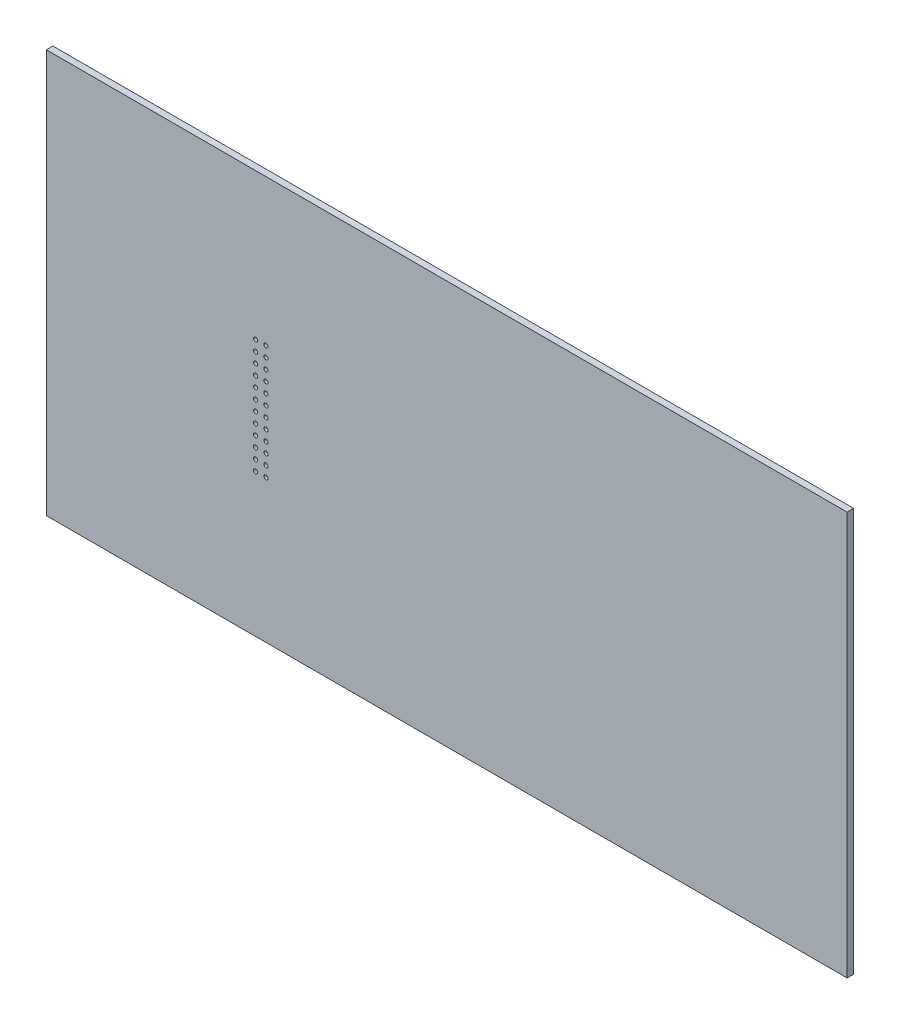
ISO-10303-21;
HEADER;
FILE_DESCRIPTION(('STEP AP214'),'2;1');
FILE_NAME('part.step','',(''),(''),'','','');
FILE_SCHEMA(('AUTOMOTIVE_DESIGN { 1 0 10303 214 1 1 1 1 }'));
ENDSEC;
DATA;
#1=APPLICATION_CONTEXT('core data for automotive mechanical design processes');
#2=APPLICATION_PROTOCOL_DEFINITION('international standard','automotive_design',2000,#1);
#3=PRODUCT_CONTEXT('',#1,'mechanical');
#4=PRODUCT('Part','Part','',(#3));
#5=PRODUCT_RELATED_PRODUCT_CATEGORY('part','',(#4));
#6=PRODUCT_DEFINITION_FORMATION('','',#4);
#7=PRODUCT_DEFINITION_CONTEXT('part definition',#1,'design');
#8=PRODUCT_DEFINITION('design','',#6,#7);
#9=PRODUCT_DEFINITION_SHAPE('','',#8);
#10=(LENGTH_UNIT() NAMED_UNIT(*) SI_UNIT(.MILLI.,.METRE.));
#11=(NAMED_UNIT(*) PLANE_ANGLE_UNIT() SI_UNIT($,.RADIAN.));
#12=(NAMED_UNIT(*) SI_UNIT($,.STERADIAN.) SOLID_ANGLE_UNIT());
#13=UNCERTAINTY_MEASURE_WITH_UNIT(LENGTH_MEASURE(1.E-05),#10,'distance_accuracy_value','');
#14=(GEOMETRIC_REPRESENTATION_CONTEXT(3) GLOBAL_UNCERTAINTY_ASSIGNED_CONTEXT((#13)) GLOBAL_UNIT_ASSIGNED_CONTEXT((#10,
#11,#12)) REPRESENTATION_CONTEXT('',''));
#15=CARTESIAN_POINT('',(0.,0.,0.));
#16=DIRECTION('',(0.,0.,1.));
#17=DIRECTION('',(1.,0.,0.));
#18=AXIS2_PLACEMENT_3D('',#15,#16,#17);
#19=CARTESIAN_POINT('',(0.,0.,1.6));
#20=DIRECTION('',(0.,0.,1.));
#21=DIRECTION('',(1.,0.,0.));
#22=AXIS2_PLACEMENT_3D('',#19,#20,#21);
#23=PLANE('',#22);
#24=CARTESIAN_POINT('',(119.5,-67.81,1.6));
#25=DIRECTION('',(0.,0.,-1.));
#26=DIRECTION('',(-1.,0.,0.));
#27=AXIS2_PLACEMENT_3D('',#24,#25,#26);
#28=CIRCLE('',#27,0.5);
#29=CARTESIAN_POINT('',(119.,-67.81,1.6));
#30=VERTEX_POINT('',#29);
#31=EDGE_CURVE('E151',#30,#30,#28,.T.);
#32=ORIENTED_EDGE('',*,*,#31,.T.);
#33=EDGE_LOOP('',(#32));
#34=FACE_BOUND('',#33,.T.);
#35=CARTESIAN_POINT('',(119.5,-70.35,1.6));
#36=DIRECTION('',(0.,0.,-1.));
#37=DIRECTION('',(-1.,0.,0.));
#38=AXIS2_PLACEMENT_3D('',#35,#36,#37);
#39=CIRCLE('',#38,0.5);
#40=CARTESIAN_POINT('',(119.,-70.35,1.6));
#41=VERTEX_POINT('',#40);
#42=EDGE_CURVE('E154',#41,#41,#39,.T.);
#43=ORIENTED_EDGE('',*,*,#42,.T.);
#44=EDGE_LOOP('',(#43));
#45=FACE_BOUND('',#44,.T.);
#46=CARTESIAN_POINT('',(119.5,-72.89,1.6));
#47=DIRECTION('',(0.,0.,-1.));
#48=DIRECTION('',(-1.,0.,0.));
#49=AXIS2_PLACEMENT_3D('',#46,#47,#48);
#50=CIRCLE('',#49,0.5);
#51=CARTESIAN_POINT('',(119.,-72.89,1.6));
#52=VERTEX_POINT('',#51);
#53=EDGE_CURVE('E157',#52,#52,#50,.T.);
#54=ORIENTED_EDGE('',*,*,#53,.T.);
#55=EDGE_LOOP('',(#54));
#56=FACE_BOUND('',#55,.T.);
#57=CARTESIAN_POINT('',(119.5,-75.43,1.6));
#58=DIRECTION('',(0.,0.,-1.));
#59=DIRECTION('',(-1.,0.,0.));
#60=AXIS2_PLACEMENT_3D('',#57,#58,#59);
#61=CIRCLE('',#60,0.5);
#62=CARTESIAN_POINT('',(119.,-75.43,1.6));
#63=VERTEX_POINT('',#62);
#64=EDGE_CURVE('E160',#63,#63,#61,.T.);
#65=ORIENTED_EDGE('',*,*,#64,.T.);
#66=EDGE_LOOP('',(#65));
#67=FACE_BOUND('',#66,.T.);
#68=CARTESIAN_POINT('',(119.5,-77.97,1.6));
#69=DIRECTION('',(0.,0.,-1.));
#70=DIRECTION('',(-1.,0.,0.));
#71=AXIS2_PLACEMENT_3D('',#68,#69,#70);
#72=CIRCLE('',#71,0.5);
#73=CARTESIAN_POINT('',(119.,-77.97,1.6));
#74=VERTEX_POINT('',#73);
#75=EDGE_CURVE('E163',#74,#74,#72,.T.);
#76=ORIENTED_EDGE('',*,*,#75,.T.);
#77=EDGE_LOOP('',(#76));
#78=FACE_BOUND('',#77,.T.);
#79=CARTESIAN_POINT('',(119.5,-80.51,1.6));
#80=DIRECTION('',(0.,0.,-1.));
#81=DIRECTION('',(-1.,0.,0.));
#82=AXIS2_PLACEMENT_3D('',#79,#80,#81);
#83=CIRCLE('',#82,0.5);
#84=CARTESIAN_POINT('',(119.,-80.51,1.6));
#85=VERTEX_POINT('',#84);
#86=EDGE_CURVE('E166',#85,#85,#83,.T.);
#87=ORIENTED_EDGE('',*,*,#86,.T.);
#88=EDGE_LOOP('',(#87));
#89=FACE_BOUND('',#88,.T.);
#90=CARTESIAN_POINT('',(116.96,-67.81,1.6));
#91=DIRECTION('',(0.,0.,-1.));
#92=DIRECTION('',(-1.,0.,0.));
#93=AXIS2_PLACEMENT_3D('',#90,#91,#92);
#94=CIRCLE('',#93,0.5);
#95=CARTESIAN_POINT('',(116.46,-67.81,1.6));
#96=VERTEX_POINT('',#95);
#97=EDGE_CURVE('E169',#96,#96,#94,.T.);
#98=ORIENTED_EDGE('',*,*,#97,.T.);
#99=EDGE_LOOP('',(#98));
#100=FACE_BOUND('',#99,.T.);
#101=CARTESIAN_POINT('',(116.96,-70.35,1.6));
#102=DIRECTION('',(0.,0.,-1.));
#103=DIRECTION('',(-1.,0.,0.));
#104=AXIS2_PLACEMENT_3D('',#101,#102,#103);
#105=CIRCLE('',#104,0.5);
#106=CARTESIAN_POINT('',(116.46,-70.35,1.6));
#107=VERTEX_POINT('',#106);
#108=EDGE_CURVE('E172',#107,#107,#105,.T.);
#109=ORIENTED_EDGE('',*,*,#108,.T.);
#110=EDGE_LOOP('',(#109));
#111=FACE_BOUND('',#110,.T.);
#112=CARTESIAN_POINT('',(116.96,-72.89,1.6));
#113=DIRECTION('',(0.,0.,-1.));
#114=DIRECTION('',(-1.,0.,0.));
#115=AXIS2_PLACEMENT_3D('',#112,#113,#114);
#116=CIRCLE('',#115,0.5);
#117=CARTESIAN_POINT('',(116.46,-72.89,1.6));
#118=VERTEX_POINT('',#117);
#119=EDGE_CURVE('E175',#118,#118,#116,.T.);
#120=ORIENTED_EDGE('',*,*,#119,.T.);
#121=EDGE_LOOP('',(#120));
#122=FACE_BOUND('',#121,.T.);
#123=CARTESIAN_POINT('',(116.96,-75.43,1.6));
#124=DIRECTION('',(0.,0.,-1.));
#125=DIRECTION('',(-1.,0.,0.));
#126=AXIS2_PLACEMENT_3D('',#123,#124,#125);
#127=CIRCLE('',#126,0.5);
#128=CARTESIAN_POINT('',(116.46,-75.43,1.6));
#129=VERTEX_POINT('',#128);
#130=EDGE_CURVE('E178',#129,#129,#127,.T.);
#131=ORIENTED_EDGE('',*,*,#130,.T.);
#132=EDGE_LOOP('',(#131));
#133=FACE_BOUND('',#132,.T.);
#134=CARTESIAN_POINT('',(116.96,-77.97,1.6));
#135=DIRECTION('',(0.,0.,-1.));
#136=DIRECTION('',(-1.,0.,0.));
#137=AXIS2_PLACEMENT_3D('',#134,#135,#136);
#138=CIRCLE('',#137,0.5);
#139=CARTESIAN_POINT('',(116.46,-77.97,1.6));
#140=VERTEX_POINT('',#139);
#141=EDGE_CURVE('E181',#140,#140,#138,.T.);
#142=ORIENTED_EDGE('',*,*,#141,.T.);
#143=EDGE_LOOP('',(#142));
#144=FACE_BOUND('',#143,.T.);
#145=CARTESIAN_POINT('',(116.96,-80.51,1.6));
#146=DIRECTION('',(0.,0.,-1.));
#147=DIRECTION('',(-1.,0.,0.));
#148=AXIS2_PLACEMENT_3D('',#145,#146,#147);
#149=CIRCLE('',#148,0.5);
#150=CARTESIAN_POINT('',(116.46,-80.51,1.6));
#151=VERTEX_POINT('',#150);
#152=EDGE_CURVE('E184',#151,#151,#149,.T.);
#153=ORIENTED_EDGE('',*,*,#152,.T.);
#154=EDGE_LOOP('',(#153));
#155=FACE_BOUND('',#154,.T.);
#156=CARTESIAN_POINT('',(119.5,-83.05,1.6));
#157=DIRECTION('',(0.,0.,-1.));
#158=DIRECTION('',(-1.,0.,0.));
#159=AXIS2_PLACEMENT_3D('',#156,#157,#158);
#160=CIRCLE('',#159,0.5);
#161=CARTESIAN_POINT('',(119.,-83.05,1.6));
#162=VERTEX_POINT('',#161);
#163=EDGE_CURVE('E187',#162,#162,#160,.T.);
#164=ORIENTED_EDGE('',*,*,#163,.T.);
#165=EDGE_LOOP('',(#164));
#166=FACE_BOUND('',#165,.T.);
#167=CARTESIAN_POINT('',(119.5,-85.59,1.6));
#168=DIRECTION('',(0.,0.,-1.));
#169=DIRECTION('',(-1.,0.,0.));
#170=AXIS2_PLACEMENT_3D('',#167,#168,#169);
#171=CIRCLE('',#170,0.5);
#172=CARTESIAN_POINT('',(119.,-85.59,1.6));
#173=VERTEX_POINT('',#172);
#174=EDGE_CURVE('E190',#173,#173,#171,.T.);
#175=ORIENTED_EDGE('',*,*,#174,.T.);
#176=EDGE_LOOP('',(#175));
#177=FACE_BOUND('',#176,.T.);
#178=CARTESIAN_POINT('',(119.5,-88.13,1.6));
#179=DIRECTION('',(0.,0.,-1.));
#180=DIRECTION('',(-1.,0.,0.));
#181=AXIS2_PLACEMENT_3D('',#178,#179,#180);
#182=CIRCLE('',#181,0.5);
#183=CARTESIAN_POINT('',(119.,-88.13,1.6));
#184=VERTEX_POINT('',#183);
#185=EDGE_CURVE('E193',#184,#184,#182,.T.);
#186=ORIENTED_EDGE('',*,*,#185,.T.);
#187=EDGE_LOOP('',(#186));
#188=FACE_BOUND('',#187,.T.);
#189=CARTESIAN_POINT('',(119.5,-90.67,1.6));
#190=DIRECTION('',(0.,0.,-1.));
#191=DIRECTION('',(-1.,0.,0.));
#192=AXIS2_PLACEMENT_3D('',#189,#190,#191);
#193=CIRCLE('',#192,0.5);
#194=CARTESIAN_POINT('',(119.,-90.67,1.6));
#195=VERTEX_POINT('',#194);
#196=EDGE_CURVE('E196',#195,#195,#193,.T.);
#197=ORIENTED_EDGE('',*,*,#196,.T.);
#198=EDGE_LOOP('',(#197));
#199=FACE_BOUND('',#198,.T.);
#200=CARTESIAN_POINT('',(119.5,-93.21,1.6));
#201=DIRECTION('',(0.,0.,-1.));
#202=DIRECTION('',(-1.,0.,0.));
#203=AXIS2_PLACEMENT_3D('',#200,#201,#202);
#204=CIRCLE('',#203,0.5);
#205=CARTESIAN_POINT('',(119.,-93.21,1.6));
#206=VERTEX_POINT('',#205);
#207=EDGE_CURVE('E199',#206,#206,#204,.T.);
#208=ORIENTED_EDGE('',*,*,#207,.T.);
#209=EDGE_LOOP('',(#208));
#210=FACE_BOUND('',#209,.T.);
#211=CARTESIAN_POINT('',(119.5,-95.75,1.6));
#212=DIRECTION('',(0.,0.,-1.));
#213=DIRECTION('',(-1.,0.,0.));
#214=AXIS2_PLACEMENT_3D('',#211,#212,#213);
#215=CIRCLE('',#214,0.5);
#216=CARTESIAN_POINT('',(119.,-95.75,1.6));
#217=VERTEX_POINT('',#216);
#218=EDGE_CURVE('E202',#217,#217,#215,.T.);
#219=ORIENTED_EDGE('',*,*,#218,.T.);
#220=EDGE_LOOP('',(#219));
#221=FACE_BOUND('',#220,.T.);
#222=CARTESIAN_POINT('',(116.96,-83.05,1.6));
#223=DIRECTION('',(0.,0.,-1.));
#224=DIRECTION('',(-1.,0.,0.));
#225=AXIS2_PLACEMENT_3D('',#222,#223,#224);
#226=CIRCLE('',#225,0.5);
#227=CARTESIAN_POINT('',(116.46,-83.05,1.6));
#228=VERTEX_POINT('',#227);
#229=EDGE_CURVE('E205',#228,#228,#226,.T.);
#230=ORIENTED_EDGE('',*,*,#229,.T.);
#231=EDGE_LOOP('',(#230));
#232=FACE_BOUND('',#231,.T.);
#233=CARTESIAN_POINT('',(116.96,-85.59,1.6));
#234=DIRECTION('',(0.,0.,-1.));
#235=DIRECTION('',(-1.,0.,0.));
#236=AXIS2_PLACEMENT_3D('',#233,#234,#235);
#237=CIRCLE('',#236,0.5);
#238=CARTESIAN_POINT('',(116.46,-85.59,1.6));
#239=VERTEX_POINT('',#238);
#240=EDGE_CURVE('E208',#239,#239,#237,.T.);
#241=ORIENTED_EDGE('',*,*,#240,.T.);
#242=EDGE_LOOP('',(#241));
#243=FACE_BOUND('',#242,.T.);
#244=CARTESIAN_POINT('',(116.96,-88.13,1.6));
#245=DIRECTION('',(0.,0.,-1.));
#246=DIRECTION('',(-1.,0.,0.));
#247=AXIS2_PLACEMENT_3D('',#244,#245,#246);
#248=CIRCLE('',#247,0.5);
#249=CARTESIAN_POINT('',(116.46,-88.13,1.6));
#250=VERTEX_POINT('',#249);
#251=EDGE_CURVE('E211',#250,#250,#248,.T.);
#252=ORIENTED_EDGE('',*,*,#251,.T.);
#253=EDGE_LOOP('',(#252));
#254=FACE_BOUND('',#253,.T.);
#255=CARTESIAN_POINT('',(116.96,-90.67,1.6));
#256=DIRECTION('',(0.,0.,-1.));
#257=DIRECTION('',(-1.,0.,0.));
#258=AXIS2_PLACEMENT_3D('',#255,#256,#257);
#259=CIRCLE('',#258,0.5);
#260=CARTESIAN_POINT('',(116.46,-90.67,1.6));
#261=VERTEX_POINT('',#260);
#262=EDGE_CURVE('E214',#261,#261,#259,.T.);
#263=ORIENTED_EDGE('',*,*,#262,.T.);
#264=EDGE_LOOP('',(#263));
#265=FACE_BOUND('',#264,.T.);
#266=CARTESIAN_POINT('',(116.96,-93.21,1.6));
#267=DIRECTION('',(0.,0.,-1.));
#268=DIRECTION('',(-1.,0.,0.));
#269=AXIS2_PLACEMENT_3D('',#266,#267,#268);
#270=CIRCLE('',#269,0.5);
#271=CARTESIAN_POINT('',(116.46,-93.21,1.6));
#272=VERTEX_POINT('',#271);
#273=EDGE_CURVE('E216',#272,#272,#270,.T.);
#274=ORIENTED_EDGE('',*,*,#273,.T.);
#275=EDGE_LOOP('',(#274));
#276=FACE_BOUND('',#275,.T.);
#277=CARTESIAN_POINT('',(116.96,-95.75,1.6));
#278=DIRECTION('',(0.,0.,-1.));
#279=DIRECTION('',(-1.,0.,0.));
#280=AXIS2_PLACEMENT_3D('',#277,#278,#279);
#281=CIRCLE('',#280,0.5);
#282=CARTESIAN_POINT('',(116.46,-95.75,1.6));
#283=VERTEX_POINT('',#282);
#284=EDGE_CURVE('E19',#283,#283,#281,.T.);
#285=ORIENTED_EDGE('',*,*,#284,.T.);
#286=EDGE_LOOP('',(#285));
#287=FACE_BOUND('',#286,.T.);
#288=DIRECTION('',(1.,0.,0.));
#289=VECTOR('',#288,1.);
#290=CARTESIAN_POINT('',(65.75,-32.,1.6));
#291=LINE('',#290,#289);
#292=CARTESIAN_POINT('',(65.75,-32.,1.6));
#293=VERTEX_POINT('',#292);
#294=CARTESIAN_POINT('',(261.75,-32.,1.6));
#295=VERTEX_POINT('',#294);
#296=EDGE_CURVE('E53',#293,#295,#291,.T.);
#297=ORIENTED_EDGE('',*,*,#296,.F.);
#298=DIRECTION('',(0.,1.,0.));
#299=VECTOR('',#298,1.);
#300=CARTESIAN_POINT('',(65.75,-130.75,1.6));
#301=LINE('',#300,#299);
#302=CARTESIAN_POINT('',(65.75,-130.75,1.6));
#303=VERTEX_POINT('',#302);
#304=EDGE_CURVE('E70',#303,#293,#301,.T.);
#305=ORIENTED_EDGE('',*,*,#304,.F.);
#306=DIRECTION('',(1.,0.,0.));
#307=VECTOR('',#306,1.);
#308=CARTESIAN_POINT('',(261.75,-130.75,1.6));
#309=LINE('',#308,#307);
#310=CARTESIAN_POINT('',(261.75,-130.75,1.6));
#311=VERTEX_POINT('',#310);
#312=EDGE_CURVE('E67',#311,#303,#309,.F.);
#313=ORIENTED_EDGE('',*,*,#312,.F.);
#314=DIRECTION('',(0.,1.,0.));
#315=VECTOR('',#314,1.);
#316=CARTESIAN_POINT('',(261.75,-32.,1.6));
#317=LINE('',#316,#315);
#318=EDGE_CURVE('E58',#295,#311,#317,.F.);
#319=ORIENTED_EDGE('',*,*,#318,.F.);
#320=EDGE_LOOP('',(#297,#305,#313,#319));
#321=FACE_BOUND('',#320,.T.);
#322=ADVANCED_FACE('F16',(#34,#45,#56,#67,#78,#89,#100,#111,#122,#133,#144,#155,#166,#177,#188,
#199,#210,#221,#232,#243,#254,#265,#276,#287,#321),#23,.T.);
#323=CARTESIAN_POINT('',(261.75,-130.75,0.));
#324=DIRECTION('',(0.,-1.,0.));
#325=DIRECTION('',(0.,0.,-1.));
#326=AXIS2_PLACEMENT_3D('',#323,#324,#325);
#327=PLANE('',#326);
#328=DIRECTION('',(0.,0.,1.));
#329=VECTOR('',#328,1.);
#330=CARTESIAN_POINT('',(65.75,-130.75,0.));
#331=LINE('',#330,#329);
#332=CARTESIAN_POINT('',(65.75,-130.75,0.));
#333=VERTEX_POINT('',#332);
#334=EDGE_CURVE('E224',#333,#303,#331,.T.);
#335=ORIENTED_EDGE('',*,*,#334,.F.);
#336=DIRECTION('',(1.,0.,0.));
#337=VECTOR('',#336,1.);
#338=CARTESIAN_POINT('',(0.,-130.75,0.));
#339=LINE('',#338,#337);
#340=CARTESIAN_POINT('',(261.75,-130.75,0.));
#341=VERTEX_POINT('',#340);
#342=EDGE_CURVE('E77',#333,#341,#339,.T.);
#343=ORIENTED_EDGE('',*,*,#342,.T.);
#344=DIRECTION('',(0.,0.,-1.));
#345=VECTOR('',#344,1.);
#346=CARTESIAN_POINT('',(261.75,-130.75,0.));
#347=LINE('',#346,#345);
#348=EDGE_CURVE('E63',#311,#341,#347,.T.);
#349=ORIENTED_EDGE('',*,*,#348,.F.);
#350=ORIENTED_EDGE('',*,*,#312,.T.);
#351=EDGE_LOOP('',(#335,#343,#349,#350));
#352=FACE_BOUND('',#351,.T.);
#353=ADVANCED_FACE('F76',(#352),#327,.T.);
#354=CARTESIAN_POINT('',(261.75,-32.,0.));
#355=DIRECTION('',(1.,0.,0.));
#356=DIRECTION('',(0.,0.,-1.));
#357=AXIS2_PLACEMENT_3D('',#354,#355,#356);
#358=PLANE('',#357);
#359=ORIENTED_EDGE('',*,*,#348,.T.);
#360=DIRECTION('',(0.,1.,0.));
#361=VECTOR('',#360,1.);
#362=CARTESIAN_POINT('',(261.75,0.,0.));
#363=LINE('',#362,#361);
#364=CARTESIAN_POINT('',(261.75,-32.,0.));
#365=VERTEX_POINT('',#364);
#366=EDGE_CURVE('E235',#341,#365,#363,.T.);
#367=ORIENTED_EDGE('',*,*,#366,.T.);
#368=DIRECTION('',(0.,0.,1.));
#369=VECTOR('',#368,1.);
#370=CARTESIAN_POINT('',(261.75,-32.,0.));
#371=LINE('',#370,#369);
#372=EDGE_CURVE('E65',#295,#365,#371,.F.);
#373=ORIENTED_EDGE('',*,*,#372,.F.);
#374=ORIENTED_EDGE('',*,*,#318,.T.);
#375=EDGE_LOOP('',(#359,#367,#373,#374));
#376=FACE_BOUND('',#375,.T.);
#377=ADVANCED_FACE('F60',(#376),#358,.T.);
#378=CARTESIAN_POINT('',(65.75,-32.,0.));
#379=DIRECTION('',(0.,1.,0.));
#380=DIRECTION('',(0.,0.,1.));
#381=AXIS2_PLACEMENT_3D('',#378,#379,#380);
#382=PLANE('',#381);
#383=ORIENTED_EDGE('',*,*,#372,.T.);
#384=DIRECTION('',(1.,0.,0.));
#385=VECTOR('',#384,1.);
#386=CARTESIAN_POINT('',(0.,-32.,0.));
#387=LINE('',#386,#385);
#388=CARTESIAN_POINT('',(65.75,-32.,0.));
#389=VERTEX_POINT('',#388);
#390=EDGE_CURVE('E232',#365,#389,#387,.F.);
#391=ORIENTED_EDGE('',*,*,#390,.T.);
#392=DIRECTION('',(0.,0.,1.));
#393=VECTOR('',#392,1.);
#394=CARTESIAN_POINT('',(65.75,-32.,0.));
#395=LINE('',#394,#393);
#396=EDGE_CURVE('E34',#293,#389,#395,.F.);
#397=ORIENTED_EDGE('',*,*,#396,.F.);
#398=ORIENTED_EDGE('',*,*,#296,.T.);
#399=EDGE_LOOP('',(#383,#391,#397,#398));
#400=FACE_BOUND('',#399,.T.);
#401=ADVANCED_FACE('F231',(#400),#382,.T.);
#402=CARTESIAN_POINT('',(65.75,-130.75,0.));
#403=DIRECTION('',(-1.,0.,0.));
#404=DIRECTION('',(0.,0.,1.));
#405=AXIS2_PLACEMENT_3D('',#402,#403,#404);
#406=PLANE('',#405);
#407=ORIENTED_EDGE('',*,*,#396,.T.);
#408=DIRECTION('',(0.,1.,0.));
#409=VECTOR('',#408,1.);
#410=CARTESIAN_POINT('',(65.75,0.,0.));
#411=LINE('',#410,#409);
#412=EDGE_CURVE('E150',#389,#333,#411,.F.);
#413=ORIENTED_EDGE('',*,*,#412,.T.);
#414=ORIENTED_EDGE('',*,*,#334,.T.);
#415=ORIENTED_EDGE('',*,*,#304,.T.);
#416=EDGE_LOOP('',(#407,#413,#414,#415));
#417=FACE_BOUND('',#416,.T.);
#418=ADVANCED_FACE('F238',(#417),#406,.T.);
#419=CARTESIAN_POINT('',(116.96,-95.75,-0.045));
#420=DIRECTION('',(0.,0.,-1.));
#421=DIRECTION('',(-1.,0.,0.));
#422=AXIS2_PLACEMENT_3D('',#419,#420,#421);
#423=CYLINDRICAL_SURFACE('',#422,0.5);
#424=ORIENTED_EDGE('',*,*,#284,.F.);
#425=EDGE_LOOP('',(#424));
#426=FACE_BOUND('',#425,.T.);
#427=CARTESIAN_POINT('',(116.96,-95.75,0.));
#428=DIRECTION('',(0.,0.,-1.));
#429=DIRECTION('',(-1.,0.,0.));
#430=AXIS2_PLACEMENT_3D('',#427,#428,#429);
#431=CIRCLE('',#430,0.5);
#432=CARTESIAN_POINT('',(116.46,-95.75,0.));
#433=VERTEX_POINT('',#432);
#434=EDGE_CURVE('E147',#433,#433,#431,.T.);
#435=ORIENTED_EDGE('',*,*,#434,.T.);
#436=EDGE_LOOP('',(#435));
#437=FACE_BOUND('',#436,.T.);
#438=ADVANCED_FACE('F240',(#426,#437),#423,.F.);
#439=CARTESIAN_POINT('',(116.96,-93.21,-0.045));
#440=DIRECTION('',(0.,0.,-1.));
#441=DIRECTION('',(-1.,0.,0.));
#442=AXIS2_PLACEMENT_3D('',#439,#440,#441);
#443=CYLINDRICAL_SURFACE('',#442,0.5);
#444=ORIENTED_EDGE('',*,*,#273,.F.);
#445=EDGE_LOOP('',(#444));
#446=FACE_BOUND('',#445,.T.);
#447=CARTESIAN_POINT('',(116.96,-93.21,0.));
#448=DIRECTION('',(0.,0.,-1.));
#449=DIRECTION('',(-1.,0.,0.));
#450=AXIS2_PLACEMENT_3D('',#447,#448,#449);
#451=CIRCLE('',#450,0.5);
#452=CARTESIAN_POINT('',(116.46,-93.21,0.));
#453=VERTEX_POINT('',#452);
#454=EDGE_CURVE('E144',#453,#453,#451,.T.);
#455=ORIENTED_EDGE('',*,*,#454,.T.);
#456=EDGE_LOOP('',(#455));
#457=FACE_BOUND('',#456,.T.);
#458=ADVANCED_FACE('F247',(#446,#457),#443,.F.);
#459=CARTESIAN_POINT('',(116.96,-90.67,-0.045));
#460=DIRECTION('',(0.,0.,-1.));
#461=DIRECTION('',(-1.,0.,0.));
#462=AXIS2_PLACEMENT_3D('',#459,#460,#461);
#463=CYLINDRICAL_SURFACE('',#462,0.5);
#464=ORIENTED_EDGE('',*,*,#262,.F.);
#465=EDGE_LOOP('',(#464));
#466=FACE_BOUND('',#465,.T.);
#467=CARTESIAN_POINT('',(116.96,-90.67,0.));
#468=DIRECTION('',(0.,0.,-1.));
#469=DIRECTION('',(-1.,0.,0.));
#470=AXIS2_PLACEMENT_3D('',#467,#468,#469);
#471=CIRCLE('',#470,0.5);
#472=CARTESIAN_POINT('',(116.46,-90.67,0.));
#473=VERTEX_POINT('',#472);
#474=EDGE_CURVE('E141',#473,#473,#471,.T.);
#475=ORIENTED_EDGE('',*,*,#474,.T.);
#476=EDGE_LOOP('',(#475));
#477=FACE_BOUND('',#476,.T.);
#478=ADVANCED_FACE('F342',(#466,#477),#463,.F.);
#479=CARTESIAN_POINT('',(116.96,-88.13,-0.045));
#480=DIRECTION('',(0.,0.,-1.));
#481=DIRECTION('',(-1.,0.,0.));
#482=AXIS2_PLACEMENT_3D('',#479,#480,#481);
#483=CYLINDRICAL_SURFACE('',#482,0.5);
#484=ORIENTED_EDGE('',*,*,#251,.F.);
#485=EDGE_LOOP('',(#484));
#486=FACE_BOUND('',#485,.T.);
#487=CARTESIAN_POINT('',(116.96,-88.13,0.));
#488=DIRECTION('',(0.,0.,-1.));
#489=DIRECTION('',(-1.,0.,0.));
#490=AXIS2_PLACEMENT_3D('',#487,#488,#489);
#491=CIRCLE('',#490,0.5);
#492=CARTESIAN_POINT('',(116.46,-88.13,0.));
#493=VERTEX_POINT('',#492);
#494=EDGE_CURVE('E138',#493,#493,#491,.T.);
#495=ORIENTED_EDGE('',*,*,#494,.T.);
#496=EDGE_LOOP('',(#495));
#497=FACE_BOUND('',#496,.T.);
#498=ADVANCED_FACE('F338',(#486,#497),#483,.F.);
#499=CARTESIAN_POINT('',(116.96,-85.59,-0.045));
#500=DIRECTION('',(0.,0.,-1.));
#501=DIRECTION('',(-1.,0.,0.));
#502=AXIS2_PLACEMENT_3D('',#499,#500,#501);
#503=CYLINDRICAL_SURFACE('',#502,0.5);
#504=ORIENTED_EDGE('',*,*,#240,.F.);
#505=EDGE_LOOP('',(#504));
#506=FACE_BOUND('',#505,.T.);
#507=CARTESIAN_POINT('',(116.96,-85.59,0.));
#508=DIRECTION('',(0.,0.,-1.));
#509=DIRECTION('',(-1.,0.,0.));
#510=AXIS2_PLACEMENT_3D('',#507,#508,#509);
#511=CIRCLE('',#510,0.5);
#512=CARTESIAN_POINT('',(116.46,-85.59,0.));
#513=VERTEX_POINT('',#512);
#514=EDGE_CURVE('E135',#513,#513,#511,.T.);
#515=ORIENTED_EDGE('',*,*,#514,.T.);
#516=EDGE_LOOP('',(#515));
#517=FACE_BOUND('',#516,.T.);
#518=ADVANCED_FACE('F334',(#506,#517),#503,.F.);
#519=CARTESIAN_POINT('',(116.96,-83.05,-0.045));
#520=DIRECTION('',(0.,0.,-1.));
#521=DIRECTION('',(-1.,0.,0.));
#522=AXIS2_PLACEMENT_3D('',#519,#520,#521);
#523=CYLINDRICAL_SURFACE('',#522,0.5);
#524=ORIENTED_EDGE('',*,*,#229,.F.);
#525=EDGE_LOOP('',(#524));
#526=FACE_BOUND('',#525,.T.);
#527=CARTESIAN_POINT('',(116.96,-83.05,0.));
#528=DIRECTION('',(0.,0.,-1.));
#529=DIRECTION('',(-1.,0.,0.));
#530=AXIS2_PLACEMENT_3D('',#527,#528,#529);
#531=CIRCLE('',#530,0.5);
#532=CARTESIAN_POINT('',(116.46,-83.05,0.));
#533=VERTEX_POINT('',#532);
#534=EDGE_CURVE('E132',#533,#533,#531,.T.);
#535=ORIENTED_EDGE('',*,*,#534,.T.);
#536=EDGE_LOOP('',(#535));
#537=FACE_BOUND('',#536,.T.);
#538=ADVANCED_FACE('F330',(#526,#537),#523,.F.);
#539=CARTESIAN_POINT('',(119.5,-95.75,-0.045));
#540=DIRECTION('',(0.,0.,-1.));
#541=DIRECTION('',(-1.,0.,0.));
#542=AXIS2_PLACEMENT_3D('',#539,#540,#541);
#543=CYLINDRICAL_SURFACE('',#542,0.5);
#544=ORIENTED_EDGE('',*,*,#218,.F.);
#545=EDGE_LOOP('',(#544));
#546=FACE_BOUND('',#545,.T.);
#547=CARTESIAN_POINT('',(119.5,-95.75,0.));
#548=DIRECTION('',(0.,0.,-1.));
#549=DIRECTION('',(-1.,0.,0.));
#550=AXIS2_PLACEMENT_3D('',#547,#548,#549);
#551=CIRCLE('',#550,0.5);
#552=CARTESIAN_POINT('',(119.,-95.75,0.));
#553=VERTEX_POINT('',#552);
#554=EDGE_CURVE('E129',#553,#553,#551,.T.);
#555=ORIENTED_EDGE('',*,*,#554,.T.);
#556=EDGE_LOOP('',(#555));
#557=FACE_BOUND('',#556,.T.);
#558=ADVANCED_FACE('F326',(#546,#557),#543,.F.);
#559=CARTESIAN_POINT('',(119.5,-93.21,-0.045));
#560=DIRECTION('',(0.,0.,-1.));
#561=DIRECTION('',(-1.,0.,0.));
#562=AXIS2_PLACEMENT_3D('',#559,#560,#561);
#563=CYLINDRICAL_SURFACE('',#562,0.5);
#564=ORIENTED_EDGE('',*,*,#207,.F.);
#565=EDGE_LOOP('',(#564));
#566=FACE_BOUND('',#565,.T.);
#567=CARTESIAN_POINT('',(119.5,-93.21,0.));
#568=DIRECTION('',(0.,0.,-1.));
#569=DIRECTION('',(-1.,0.,0.));
#570=AXIS2_PLACEMENT_3D('',#567,#568,#569);
#571=CIRCLE('',#570,0.5);
#572=CARTESIAN_POINT('',(119.,-93.21,0.));
#573=VERTEX_POINT('',#572);
#574=EDGE_CURVE('E126',#573,#573,#571,.T.);
#575=ORIENTED_EDGE('',*,*,#574,.T.);
#576=EDGE_LOOP('',(#575));
#577=FACE_BOUND('',#576,.T.);
#578=ADVANCED_FACE('F322',(#566,#577),#563,.F.);
#579=CARTESIAN_POINT('',(119.5,-90.67,-0.045));
#580=DIRECTION('',(0.,0.,-1.));
#581=DIRECTION('',(-1.,0.,0.));
#582=AXIS2_PLACEMENT_3D('',#579,#580,#581);
#583=CYLINDRICAL_SURFACE('',#582,0.5);
#584=ORIENTED_EDGE('',*,*,#196,.F.);
#585=EDGE_LOOP('',(#584));
#586=FACE_BOUND('',#585,.T.);
#587=CARTESIAN_POINT('',(119.5,-90.67,0.));
#588=DIRECTION('',(0.,0.,-1.));
#589=DIRECTION('',(-1.,0.,0.));
#590=AXIS2_PLACEMENT_3D('',#587,#588,#589);
#591=CIRCLE('',#590,0.5);
#592=CARTESIAN_POINT('',(119.,-90.67,0.));
#593=VERTEX_POINT('',#592);
#594=EDGE_CURVE('E123',#593,#593,#591,.T.);
#595=ORIENTED_EDGE('',*,*,#594,.T.);
#596=EDGE_LOOP('',(#595));
#597=FACE_BOUND('',#596,.T.);
#598=ADVANCED_FACE('F318',(#586,#597),#583,.F.);
#599=CARTESIAN_POINT('',(119.5,-88.13,-0.045));
#600=DIRECTION('',(0.,0.,-1.));
#601=DIRECTION('',(-1.,0.,0.));
#602=AXIS2_PLACEMENT_3D('',#599,#600,#601);
#603=CYLINDRICAL_SURFACE('',#602,0.5);
#604=ORIENTED_EDGE('',*,*,#185,.F.);
#605=EDGE_LOOP('',(#604));
#606=FACE_BOUND('',#605,.T.);
#607=CARTESIAN_POINT('',(119.5,-88.13,0.));
#608=DIRECTION('',(0.,0.,-1.));
#609=DIRECTION('',(-1.,0.,0.));
#610=AXIS2_PLACEMENT_3D('',#607,#608,#609);
#611=CIRCLE('',#610,0.5);
#612=CARTESIAN_POINT('',(119.,-88.13,0.));
#613=VERTEX_POINT('',#612);
#614=EDGE_CURVE('E120',#613,#613,#611,.T.);
#615=ORIENTED_EDGE('',*,*,#614,.T.);
#616=EDGE_LOOP('',(#615));
#617=FACE_BOUND('',#616,.T.);
#618=ADVANCED_FACE('F314',(#606,#617),#603,.F.);
#619=CARTESIAN_POINT('',(119.5,-85.59,-0.045));
#620=DIRECTION('',(0.,0.,-1.));
#621=DIRECTION('',(-1.,0.,0.));
#622=AXIS2_PLACEMENT_3D('',#619,#620,#621);
#623=CYLINDRICAL_SURFACE('',#622,0.5);
#624=ORIENTED_EDGE('',*,*,#174,.F.);
#625=EDGE_LOOP('',(#624));
#626=FACE_BOUND('',#625,.T.);
#627=CARTESIAN_POINT('',(119.5,-85.59,0.));
#628=DIRECTION('',(0.,0.,-1.));
#629=DIRECTION('',(-1.,0.,0.));
#630=AXIS2_PLACEMENT_3D('',#627,#628,#629);
#631=CIRCLE('',#630,0.5);
#632=CARTESIAN_POINT('',(119.,-85.59,0.));
#633=VERTEX_POINT('',#632);
#634=EDGE_CURVE('E117',#633,#633,#631,.T.);
#635=ORIENTED_EDGE('',*,*,#634,.T.);
#636=EDGE_LOOP('',(#635));
#637=FACE_BOUND('',#636,.T.);
#638=ADVANCED_FACE('F310',(#626,#637),#623,.F.);
#639=CARTESIAN_POINT('',(119.5,-83.05,-0.045));
#640=DIRECTION('',(0.,0.,-1.));
#641=DIRECTION('',(-1.,0.,0.));
#642=AXIS2_PLACEMENT_3D('',#639,#640,#641);
#643=CYLINDRICAL_SURFACE('',#642,0.5);
#644=ORIENTED_EDGE('',*,*,#163,.F.);
#645=EDGE_LOOP('',(#644));
#646=FACE_BOUND('',#645,.T.);
#647=CARTESIAN_POINT('',(119.5,-83.05,0.));
#648=DIRECTION('',(0.,0.,-1.));
#649=DIRECTION('',(-1.,0.,0.));
#650=AXIS2_PLACEMENT_3D('',#647,#648,#649);
#651=CIRCLE('',#650,0.5);
#652=CARTESIAN_POINT('',(119.,-83.05,0.));
#653=VERTEX_POINT('',#652);
#654=EDGE_CURVE('E114',#653,#653,#651,.T.);
#655=ORIENTED_EDGE('',*,*,#654,.T.);
#656=EDGE_LOOP('',(#655));
#657=FACE_BOUND('',#656,.T.);
#658=ADVANCED_FACE('F306',(#646,#657),#643,.F.);
#659=CARTESIAN_POINT('',(116.96,-80.51,-0.045));
#660=DIRECTION('',(0.,0.,-1.));
#661=DIRECTION('',(-1.,0.,0.));
#662=AXIS2_PLACEMENT_3D('',#659,#660,#661);
#663=CYLINDRICAL_SURFACE('',#662,0.5);
#664=ORIENTED_EDGE('',*,*,#152,.F.);
#665=EDGE_LOOP('',(#664));
#666=FACE_BOUND('',#665,.T.);
#667=CARTESIAN_POINT('',(116.96,-80.51,0.));
#668=DIRECTION('',(0.,0.,-1.));
#669=DIRECTION('',(-1.,0.,0.));
#670=AXIS2_PLACEMENT_3D('',#667,#668,#669);
#671=CIRCLE('',#670,0.5);
#672=CARTESIAN_POINT('',(116.46,-80.51,0.));
#673=VERTEX_POINT('',#672);
#674=EDGE_CURVE('E111',#673,#673,#671,.T.);
#675=ORIENTED_EDGE('',*,*,#674,.T.);
#676=EDGE_LOOP('',(#675));
#677=FACE_BOUND('',#676,.T.);
#678=ADVANCED_FACE('F302',(#666,#677),#663,.F.);
#679=CARTESIAN_POINT('',(116.96,-77.97,-0.045));
#680=DIRECTION('',(0.,0.,-1.));
#681=DIRECTION('',(-1.,0.,0.));
#682=AXIS2_PLACEMENT_3D('',#679,#680,#681);
#683=CYLINDRICAL_SURFACE('',#682,0.5);
#684=ORIENTED_EDGE('',*,*,#141,.F.);
#685=EDGE_LOOP('',(#684));
#686=FACE_BOUND('',#685,.T.);
#687=CARTESIAN_POINT('',(116.96,-77.97,0.));
#688=DIRECTION('',(0.,0.,-1.));
#689=DIRECTION('',(-1.,0.,0.));
#690=AXIS2_PLACEMENT_3D('',#687,#688,#689);
#691=CIRCLE('',#690,0.5);
#692=CARTESIAN_POINT('',(116.46,-77.97,0.));
#693=VERTEX_POINT('',#692);
#694=EDGE_CURVE('E108',#693,#693,#691,.T.);
#695=ORIENTED_EDGE('',*,*,#694,.T.);
#696=EDGE_LOOP('',(#695));
#697=FACE_BOUND('',#696,.T.);
#698=ADVANCED_FACE('F298',(#686,#697),#683,.F.);
#699=CARTESIAN_POINT('',(116.96,-75.43,-0.045));
#700=DIRECTION('',(0.,0.,-1.));
#701=DIRECTION('',(-1.,0.,0.));
#702=AXIS2_PLACEMENT_3D('',#699,#700,#701);
#703=CYLINDRICAL_SURFACE('',#702,0.5);
#704=ORIENTED_EDGE('',*,*,#130,.F.);
#705=EDGE_LOOP('',(#704));
#706=FACE_BOUND('',#705,.T.);
#707=CARTESIAN_POINT('',(116.96,-75.43,0.));
#708=DIRECTION('',(0.,0.,-1.));
#709=DIRECTION('',(-1.,0.,0.));
#710=AXIS2_PLACEMENT_3D('',#707,#708,#709);
#711=CIRCLE('',#710,0.5);
#712=CARTESIAN_POINT('',(116.46,-75.43,0.));
#713=VERTEX_POINT('',#712);
#714=EDGE_CURVE('E105',#713,#713,#711,.T.);
#715=ORIENTED_EDGE('',*,*,#714,.T.);
#716=EDGE_LOOP('',(#715));
#717=FACE_BOUND('',#716,.T.);
#718=ADVANCED_FACE('F294',(#706,#717),#703,.F.);
#719=CARTESIAN_POINT('',(116.96,-72.89,-0.045));
#720=DIRECTION('',(0.,0.,-1.));
#721=DIRECTION('',(-1.,0.,0.));
#722=AXIS2_PLACEMENT_3D('',#719,#720,#721);
#723=CYLINDRICAL_SURFACE('',#722,0.5);
#724=ORIENTED_EDGE('',*,*,#119,.F.);
#725=EDGE_LOOP('',(#724));
#726=FACE_BOUND('',#725,.T.);
#727=CARTESIAN_POINT('',(116.96,-72.89,0.));
#728=DIRECTION('',(0.,0.,-1.));
#729=DIRECTION('',(-1.,0.,0.));
#730=AXIS2_PLACEMENT_3D('',#727,#728,#729);
#731=CIRCLE('',#730,0.5);
#732=CARTESIAN_POINT('',(116.46,-72.89,0.));
#733=VERTEX_POINT('',#732);
#734=EDGE_CURVE('E102',#733,#733,#731,.T.);
#735=ORIENTED_EDGE('',*,*,#734,.T.);
#736=EDGE_LOOP('',(#735));
#737=FACE_BOUND('',#736,.T.);
#738=ADVANCED_FACE('F290',(#726,#737),#723,.F.);
#739=CARTESIAN_POINT('',(116.96,-70.35,-0.045));
#740=DIRECTION('',(0.,0.,-1.));
#741=DIRECTION('',(-1.,0.,0.));
#742=AXIS2_PLACEMENT_3D('',#739,#740,#741);
#743=CYLINDRICAL_SURFACE('',#742,0.5);
#744=ORIENTED_EDGE('',*,*,#108,.F.);
#745=EDGE_LOOP('',(#744));
#746=FACE_BOUND('',#745,.T.);
#747=CARTESIAN_POINT('',(116.96,-70.35,0.));
#748=DIRECTION('',(0.,0.,-1.));
#749=DIRECTION('',(-1.,0.,0.));
#750=AXIS2_PLACEMENT_3D('',#747,#748,#749);
#751=CIRCLE('',#750,0.5);
#752=CARTESIAN_POINT('',(116.46,-70.35,0.));
#753=VERTEX_POINT('',#752);
#754=EDGE_CURVE('E99',#753,#753,#751,.T.);
#755=ORIENTED_EDGE('',*,*,#754,.T.);
#756=EDGE_LOOP('',(#755));
#757=FACE_BOUND('',#756,.T.);
#758=ADVANCED_FACE('F286',(#746,#757),#743,.F.);
#759=CARTESIAN_POINT('',(116.96,-67.81,-0.045));
#760=DIRECTION('',(0.,0.,-1.));
#761=DIRECTION('',(-1.,0.,0.));
#762=AXIS2_PLACEMENT_3D('',#759,#760,#761);
#763=CYLINDRICAL_SURFACE('',#762,0.5);
#764=ORIENTED_EDGE('',*,*,#97,.F.);
#765=EDGE_LOOP('',(#764));
#766=FACE_BOUND('',#765,.T.);
#767=CARTESIAN_POINT('',(116.96,-67.81,0.));
#768=DIRECTION('',(0.,0.,-1.));
#769=DIRECTION('',(-1.,0.,0.));
#770=AXIS2_PLACEMENT_3D('',#767,#768,#769);
#771=CIRCLE('',#770,0.5);
#772=CARTESIAN_POINT('',(116.46,-67.81,0.));
#773=VERTEX_POINT('',#772);
#774=EDGE_CURVE('E96',#773,#773,#771,.T.);
#775=ORIENTED_EDGE('',*,*,#774,.T.);
#776=EDGE_LOOP('',(#775));
#777=FACE_BOUND('',#776,.T.);
#778=ADVANCED_FACE('F282',(#766,#777),#763,.F.);
#779=CARTESIAN_POINT('',(119.5,-80.51,-0.045));
#780=DIRECTION('',(0.,0.,-1.));
#781=DIRECTION('',(-1.,0.,0.));
#782=AXIS2_PLACEMENT_3D('',#779,#780,#781);
#783=CYLINDRICAL_SURFACE('',#782,0.5);
#784=ORIENTED_EDGE('',*,*,#86,.F.);
#785=EDGE_LOOP('',(#784));
#786=FACE_BOUND('',#785,.T.);
#787=CARTESIAN_POINT('',(119.5,-80.51,0.));
#788=DIRECTION('',(0.,0.,-1.));
#789=DIRECTION('',(-1.,0.,0.));
#790=AXIS2_PLACEMENT_3D('',#787,#788,#789);
#791=CIRCLE('',#790,0.5);
#792=CARTESIAN_POINT('',(119.,-80.51,0.));
#793=VERTEX_POINT('',#792);
#794=EDGE_CURVE('E93',#793,#793,#791,.T.);
#795=ORIENTED_EDGE('',*,*,#794,.T.);
#796=EDGE_LOOP('',(#795));
#797=FACE_BOUND('',#796,.T.);
#798=ADVANCED_FACE('F278',(#786,#797),#783,.F.);
#799=CARTESIAN_POINT('',(119.5,-77.97,-0.045));
#800=DIRECTION('',(0.,0.,-1.));
#801=DIRECTION('',(-1.,0.,0.));
#802=AXIS2_PLACEMENT_3D('',#799,#800,#801);
#803=CYLINDRICAL_SURFACE('',#802,0.5);
#804=ORIENTED_EDGE('',*,*,#75,.F.);
#805=EDGE_LOOP('',(#804));
#806=FACE_BOUND('',#805,.T.);
#807=CARTESIAN_POINT('',(119.5,-77.97,0.));
#808=DIRECTION('',(0.,0.,-1.));
#809=DIRECTION('',(-1.,0.,0.));
#810=AXIS2_PLACEMENT_3D('',#807,#808,#809);
#811=CIRCLE('',#810,0.5);
#812=CARTESIAN_POINT('',(119.,-77.97,0.));
#813=VERTEX_POINT('',#812);
#814=EDGE_CURVE('E90',#813,#813,#811,.T.);
#815=ORIENTED_EDGE('',*,*,#814,.T.);
#816=EDGE_LOOP('',(#815));
#817=FACE_BOUND('',#816,.T.);
#818=ADVANCED_FACE('F274',(#806,#817),#803,.F.);
#819=CARTESIAN_POINT('',(119.5,-75.43,-0.045));
#820=DIRECTION('',(0.,0.,-1.));
#821=DIRECTION('',(-1.,0.,0.));
#822=AXIS2_PLACEMENT_3D('',#819,#820,#821);
#823=CYLINDRICAL_SURFACE('',#822,0.5);
#824=ORIENTED_EDGE('',*,*,#64,.F.);
#825=EDGE_LOOP('',(#824));
#826=FACE_BOUND('',#825,.T.);
#827=CARTESIAN_POINT('',(119.5,-75.43,0.));
#828=DIRECTION('',(0.,0.,-1.));
#829=DIRECTION('',(-1.,0.,0.));
#830=AXIS2_PLACEMENT_3D('',#827,#828,#829);
#831=CIRCLE('',#830,0.5);
#832=CARTESIAN_POINT('',(119.,-75.43,0.));
#833=VERTEX_POINT('',#832);
#834=EDGE_CURVE('E87',#833,#833,#831,.T.);
#835=ORIENTED_EDGE('',*,*,#834,.T.);
#836=EDGE_LOOP('',(#835));
#837=FACE_BOUND('',#836,.T.);
#838=ADVANCED_FACE('F270',(#826,#837),#823,.F.);
#839=CARTESIAN_POINT('',(119.5,-72.89,-0.045));
#840=DIRECTION('',(0.,0.,-1.));
#841=DIRECTION('',(-1.,0.,0.));
#842=AXIS2_PLACEMENT_3D('',#839,#840,#841);
#843=CYLINDRICAL_SURFACE('',#842,0.5);
#844=ORIENTED_EDGE('',*,*,#53,.F.);
#845=EDGE_LOOP('',(#844));
#846=FACE_BOUND('',#845,.T.);
#847=CARTESIAN_POINT('',(119.5,-72.89,0.));
#848=DIRECTION('',(0.,0.,-1.));
#849=DIRECTION('',(-1.,0.,0.));
#850=AXIS2_PLACEMENT_3D('',#847,#848,#849);
#851=CIRCLE('',#850,0.5);
#852=CARTESIAN_POINT('',(119.,-72.89,0.));
#853=VERTEX_POINT('',#852);
#854=EDGE_CURVE('E84',#853,#853,#851,.T.);
#855=ORIENTED_EDGE('',*,*,#854,.T.);
#856=EDGE_LOOP('',(#855));
#857=FACE_BOUND('',#856,.T.);
#858=ADVANCED_FACE('F266',(#846,#857),#843,.F.);
#859=CARTESIAN_POINT('',(119.5,-70.35,-0.045));
#860=DIRECTION('',(0.,0.,-1.));
#861=DIRECTION('',(-1.,0.,0.));
#862=AXIS2_PLACEMENT_3D('',#859,#860,#861);
#863=CYLINDRICAL_SURFACE('',#862,0.5);
#864=ORIENTED_EDGE('',*,*,#42,.F.);
#865=EDGE_LOOP('',(#864));
#866=FACE_BOUND('',#865,.T.);
#867=CARTESIAN_POINT('',(119.5,-70.35,0.));
#868=DIRECTION('',(0.,0.,-1.));
#869=DIRECTION('',(-1.,0.,0.));
#870=AXIS2_PLACEMENT_3D('',#867,#868,#869);
#871=CIRCLE('',#870,0.5);
#872=CARTESIAN_POINT('',(119.,-70.35,0.));
#873=VERTEX_POINT('',#872);
#874=EDGE_CURVE('E25',#873,#873,#871,.T.);
#875=ORIENTED_EDGE('',*,*,#874,.T.);
#876=EDGE_LOOP('',(#875));
#877=FACE_BOUND('',#876,.T.);
#878=ADVANCED_FACE('F258',(#866,#877),#863,.F.);
#879=CARTESIAN_POINT('',(119.5,-67.81,-0.045));
#880=DIRECTION('',(0.,0.,-1.));
#881=DIRECTION('',(-1.,0.,0.));
#882=AXIS2_PLACEMENT_3D('',#879,#880,#881);
#883=CYLINDRICAL_SURFACE('',#882,0.5);
#884=ORIENTED_EDGE('',*,*,#31,.F.);
#885=EDGE_LOOP('',(#884));
#886=FACE_BOUND('',#885,.T.);
#887=CARTESIAN_POINT('',(119.5,-67.81,0.));
#888=DIRECTION('',(0.,0.,-1.));
#889=DIRECTION('',(-1.,0.,0.));
#890=AXIS2_PLACEMENT_3D('',#887,#888,#889);
#891=CIRCLE('',#890,0.5);
#892=CARTESIAN_POINT('',(119.,-67.81,0.));
#893=VERTEX_POINT('',#892);
#894=EDGE_CURVE('E10',#893,#893,#891,.T.);
#895=ORIENTED_EDGE('',*,*,#894,.T.);
#896=EDGE_LOOP('',(#895));
#897=FACE_BOUND('',#896,.T.);
#898=ADVANCED_FACE('F252',(#886,#897),#883,.F.);
#899=CARTESIAN_POINT('',(0.,0.,0.));
#900=DIRECTION('',(0.,0.,1.));
#901=DIRECTION('',(1.,0.,0.));
#902=AXIS2_PLACEMENT_3D('',#899,#900,#901);
#903=PLANE('',#902);
#904=ORIENTED_EDGE('',*,*,#894,.F.);
#905=EDGE_LOOP('',(#904));
#906=FACE_BOUND('',#905,.T.);
#907=ORIENTED_EDGE('',*,*,#874,.F.);
#908=EDGE_LOOP('',(#907));
#909=FACE_BOUND('',#908,.T.);
#910=ORIENTED_EDGE('',*,*,#854,.F.);
#911=EDGE_LOOP('',(#910));
#912=FACE_BOUND('',#911,.T.);
#913=ORIENTED_EDGE('',*,*,#834,.F.);
#914=EDGE_LOOP('',(#913));
#915=FACE_BOUND('',#914,.T.);
#916=ORIENTED_EDGE('',*,*,#814,.F.);
#917=EDGE_LOOP('',(#916));
#918=FACE_BOUND('',#917,.T.);
#919=ORIENTED_EDGE('',*,*,#794,.F.);
#920=EDGE_LOOP('',(#919));
#921=FACE_BOUND('',#920,.T.);
#922=ORIENTED_EDGE('',*,*,#774,.F.);
#923=EDGE_LOOP('',(#922));
#924=FACE_BOUND('',#923,.T.);
#925=ORIENTED_EDGE('',*,*,#754,.F.);
#926=EDGE_LOOP('',(#925));
#927=FACE_BOUND('',#926,.T.);
#928=ORIENTED_EDGE('',*,*,#734,.F.);
#929=EDGE_LOOP('',(#928));
#930=FACE_BOUND('',#929,.T.);
#931=ORIENTED_EDGE('',*,*,#714,.F.);
#932=EDGE_LOOP('',(#931));
#933=FACE_BOUND('',#932,.T.);
#934=ORIENTED_EDGE('',*,*,#694,.F.);
#935=EDGE_LOOP('',(#934));
#936=FACE_BOUND('',#935,.T.);
#937=ORIENTED_EDGE('',*,*,#674,.F.);
#938=EDGE_LOOP('',(#937));
#939=FACE_BOUND('',#938,.T.);
#940=ORIENTED_EDGE('',*,*,#654,.F.);
#941=EDGE_LOOP('',(#940));
#942=FACE_BOUND('',#941,.T.);
#943=ORIENTED_EDGE('',*,*,#634,.F.);
#944=EDGE_LOOP('',(#943));
#945=FACE_BOUND('',#944,.T.);
#946=ORIENTED_EDGE('',*,*,#614,.F.);
#947=EDGE_LOOP('',(#946));
#948=FACE_BOUND('',#947,.T.);
#949=ORIENTED_EDGE('',*,*,#594,.F.);
#950=EDGE_LOOP('',(#949));
#951=FACE_BOUND('',#950,.T.);
#952=ORIENTED_EDGE('',*,*,#574,.F.);
#953=EDGE_LOOP('',(#952));
#954=FACE_BOUND('',#953,.T.);
#955=ORIENTED_EDGE('',*,*,#554,.F.);
#956=EDGE_LOOP('',(#955));
#957=FACE_BOUND('',#956,.T.);
#958=ORIENTED_EDGE('',*,*,#534,.F.);
#959=EDGE_LOOP('',(#958));
#960=FACE_BOUND('',#959,.T.);
#961=ORIENTED_EDGE('',*,*,#514,.F.);
#962=EDGE_LOOP('',(#961));
#963=FACE_BOUND('',#962,.T.);
#964=ORIENTED_EDGE('',*,*,#494,.F.);
#965=EDGE_LOOP('',(#964));
#966=FACE_BOUND('',#965,.T.);
#967=ORIENTED_EDGE('',*,*,#474,.F.);
#968=EDGE_LOOP('',(#967));
#969=FACE_BOUND('',#968,.T.);
#970=ORIENTED_EDGE('',*,*,#454,.F.);
#971=EDGE_LOOP('',(#970));
#972=FACE_BOUND('',#971,.T.);
#973=ORIENTED_EDGE('',*,*,#434,.F.);
#974=EDGE_LOOP('',(#973));
#975=FACE_BOUND('',#974,.T.);
#976=ORIENTED_EDGE('',*,*,#390,.F.);
#977=ORIENTED_EDGE('',*,*,#366,.F.);
#978=ORIENTED_EDGE('',*,*,#342,.F.);
#979=ORIENTED_EDGE('',*,*,#412,.F.);
#980=EDGE_LOOP('',(#976,#977,#978,#979));
#981=FACE_BOUND('',#980,.T.);
#982=ADVANCED_FACE('F234',(#906,#909,#912,#915,#918,#921,#924,#927,#930,#933,#936,#939,#942,
#945,#948,#951,#954,#957,#960,#963,#966,#969,#972,#975,#981),#903,.F.);
#983=CLOSED_SHELL('',(#322,#353,#377,#401,#418,#438,#458,#478,#498,#518,#538,#558,#578,#598,
#618,#638,#658,#678,#698,#718,#738,#758,#778,#798,#818,#838,#858,#878,#898,#982));
#984=MANIFOLD_SOLID_BREP('B1',#983);
#985=ADVANCED_BREP_SHAPE_REPRESENTATION('',(#18,#984),#14);
#986=SHAPE_DEFINITION_REPRESENTATION(#9,#985);
ENDSEC;
END-ISO-10303-21;
